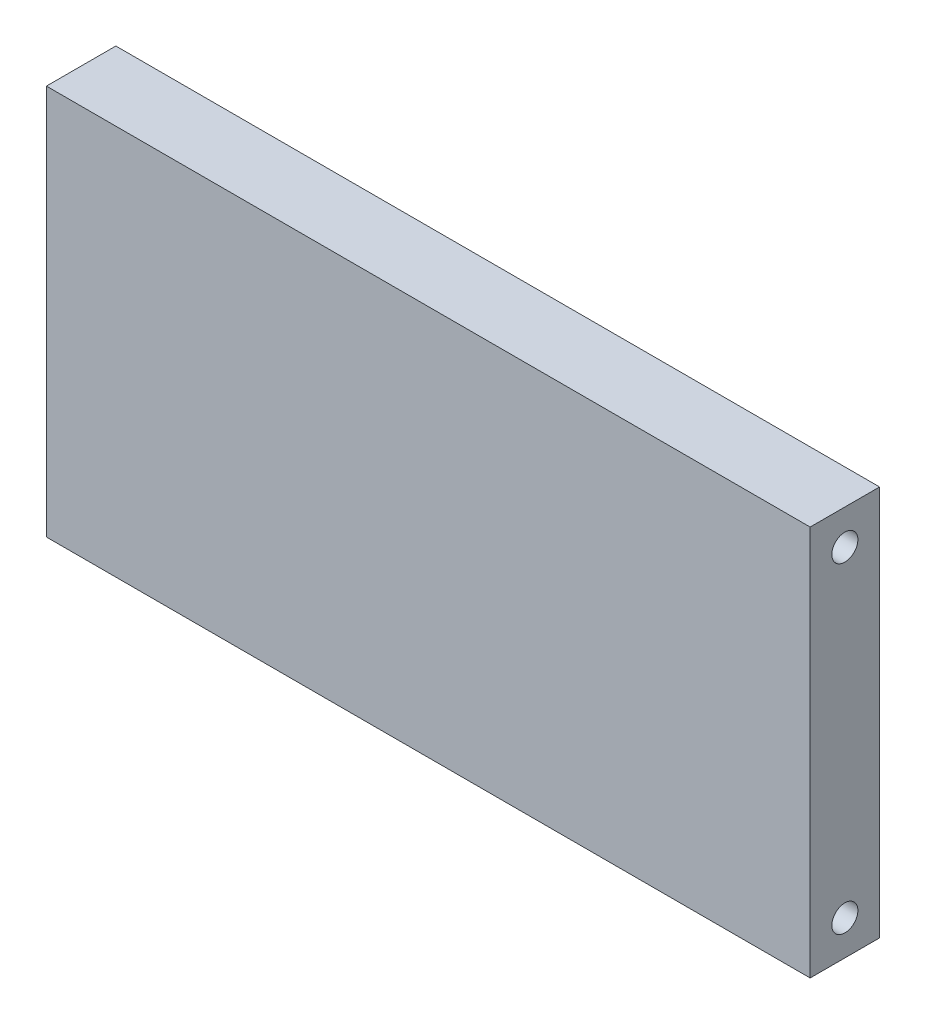
ISO-10303-21;
HEADER;
FILE_DESCRIPTION(('STEP AP214'),'2;1');
FILE_NAME('part.step','',(''),(''),'','','');
FILE_SCHEMA(('AUTOMOTIVE_DESIGN { 1 0 10303 214 1 1 1 1 }'));
ENDSEC;
DATA;
#1=APPLICATION_CONTEXT('core data for automotive mechanical design processes');
#2=APPLICATION_PROTOCOL_DEFINITION('international standard','automotive_design',2000,#1);
#3=PRODUCT_CONTEXT('',#1,'mechanical');
#4=PRODUCT('Part','Part','',(#3));
#5=PRODUCT_RELATED_PRODUCT_CATEGORY('part','',(#4));
#6=PRODUCT_DEFINITION_FORMATION('','',#4);
#7=PRODUCT_DEFINITION_CONTEXT('part definition',#1,'design');
#8=PRODUCT_DEFINITION('design','',#6,#7);
#9=PRODUCT_DEFINITION_SHAPE('','',#8);
#10=(LENGTH_UNIT() NAMED_UNIT(*) SI_UNIT(.MILLI.,.METRE.));
#11=(NAMED_UNIT(*) PLANE_ANGLE_UNIT() SI_UNIT($,.RADIAN.));
#12=(NAMED_UNIT(*) SI_UNIT($,.STERADIAN.) SOLID_ANGLE_UNIT());
#13=UNCERTAINTY_MEASURE_WITH_UNIT(LENGTH_MEASURE(1.E-05),#10,'distance_accuracy_value','');
#14=(GEOMETRIC_REPRESENTATION_CONTEXT(3) GLOBAL_UNCERTAINTY_ASSIGNED_CONTEXT((#13)) GLOBAL_UNIT_ASSIGNED_CONTEXT((#10,
#11,#12)) REPRESENTATION_CONTEXT('',''));
#15=CARTESIAN_POINT('',(0.,0.,0.));
#16=DIRECTION('',(0.,0.,1.));
#17=DIRECTION('',(1.,0.,0.));
#18=AXIS2_PLACEMENT_3D('',#15,#16,#17);
#19=CARTESIAN_POINT('',(0.,0.,8.));
#20=DIRECTION('',(1.,0.,0.));
#21=DIRECTION('',(0.,0.,-1.));
#22=AXIS2_PLACEMENT_3D('',#19,#20,#21);
#23=PLANE('',#22);
#24=CARTESIAN_POINT('',(0.,41.,3.99999999999999));
#25=DIRECTION('',(-1.,0.,0.));
#26=DIRECTION('',(0.,0.,1.));
#27=AXIS2_PLACEMENT_3D('',#24,#25,#26);
#28=CIRCLE('',#27,1.5);
#29=CARTESIAN_POINT('',(0.,41.,5.5));
#30=VERTEX_POINT('',#29);
#31=EDGE_CURVE('E129',#30,#30,#28,.T.);
#32=ORIENTED_EDGE('',*,*,#31,.F.);
#33=EDGE_LOOP('',(#32));
#34=FACE_BOUND('',#33,.T.);
#35=CARTESIAN_POINT('',(0.,4.,4.));
#36=DIRECTION('',(-1.,0.,0.));
#37=DIRECTION('',(0.,0.,-1.));
#38=AXIS2_PLACEMENT_3D('',#35,#36,#37);
#39=CIRCLE('',#38,1.5);
#40=CARTESIAN_POINT('',(0.,4.,2.5));
#41=VERTEX_POINT('',#40);
#42=EDGE_CURVE('E136',#41,#41,#39,.T.);
#43=ORIENTED_EDGE('',*,*,#42,.F.);
#44=EDGE_LOOP('',(#43));
#45=FACE_BOUND('',#44,.T.);
#46=DIRECTION('',(0.,-1.,0.));
#47=VECTOR('',#46,1.);
#48=CARTESIAN_POINT('',(0.,0.,0.));
#49=LINE('',#48,#47);
#50=CARTESIAN_POINT('',(0.,45.,0.));
#51=VERTEX_POINT('',#50);
#52=CARTESIAN_POINT('',(0.,0.,0.));
#53=VERTEX_POINT('',#52);
#54=EDGE_CURVE('E113',#51,#53,#49,.T.);
#55=ORIENTED_EDGE('',*,*,#54,.T.);
#56=DIRECTION('',(0.,0.,-1.));
#57=VECTOR('',#56,1.);
#58=CARTESIAN_POINT('',(0.,0.,8.));
#59=LINE('',#58,#57);
#60=CARTESIAN_POINT('',(0.,0.,8.));
#61=VERTEX_POINT('',#60);
#62=EDGE_CURVE('E11',#61,#53,#59,.T.);
#63=ORIENTED_EDGE('',*,*,#62,.F.);
#64=DIRECTION('',(0.,-1.,0.));
#65=VECTOR('',#64,1.);
#66=CARTESIAN_POINT('',(0.,0.,8.));
#67=LINE('',#66,#65);
#68=CARTESIAN_POINT('',(0.,45.,8.));
#69=VERTEX_POINT('',#68);
#70=EDGE_CURVE('E96',#69,#61,#67,.T.);
#71=ORIENTED_EDGE('',*,*,#70,.F.);
#72=DIRECTION('',(0.,0.,-1.));
#73=VECTOR('',#72,1.);
#74=CARTESIAN_POINT('',(0.,45.,8.));
#75=LINE('',#74,#73);
#76=EDGE_CURVE('E109',#69,#51,#75,.T.);
#77=ORIENTED_EDGE('',*,*,#76,.T.);
#78=EDGE_LOOP('',(#55,#63,#71,#77));
#79=FACE_BOUND('',#78,.T.);
#80=ADVANCED_FACE('F42',(#34,#45,#79),#23,.F.);
#81=CARTESIAN_POINT('',(0.,0.,8.));
#82=DIRECTION('',(0.,1.,0.));
#83=DIRECTION('',(0.,0.,1.));
#84=AXIS2_PLACEMENT_3D('',#81,#82,#83);
#85=PLANE('',#84);
#86=DIRECTION('',(1.,0.,0.));
#87=VECTOR('',#86,1.);
#88=CARTESIAN_POINT('',(0.,0.,0.));
#89=LINE('',#88,#87);
#90=CARTESIAN_POINT('',(88.,0.,0.));
#91=VERTEX_POINT('',#90);
#92=EDGE_CURVE('E101',#53,#91,#89,.T.);
#93=ORIENTED_EDGE('',*,*,#92,.T.);
#94=DIRECTION('',(0.,0.,-1.));
#95=VECTOR('',#94,1.);
#96=CARTESIAN_POINT('',(88.,0.,8.));
#97=LINE('',#96,#95);
#98=CARTESIAN_POINT('',(88.,0.,8.));
#99=VERTEX_POINT('',#98);
#100=EDGE_CURVE('E52',#99,#91,#97,.T.);
#101=ORIENTED_EDGE('',*,*,#100,.F.);
#102=DIRECTION('',(1.,0.,0.));
#103=VECTOR('',#102,1.);
#104=CARTESIAN_POINT('',(0.,0.,8.));
#105=LINE('',#104,#103);
#106=EDGE_CURVE('E91',#61,#99,#105,.T.);
#107=ORIENTED_EDGE('',*,*,#106,.F.);
#108=ORIENTED_EDGE('',*,*,#62,.T.);
#109=EDGE_LOOP('',(#93,#101,#107,#108));
#110=FACE_BOUND('',#109,.T.);
#111=ADVANCED_FACE('F100',(#110),#85,.F.);
#112=CARTESIAN_POINT('',(88.,0.,8.));
#113=DIRECTION('',(-1.,0.,0.));
#114=DIRECTION('',(0.,0.,1.));
#115=AXIS2_PLACEMENT_3D('',#112,#113,#114);
#116=PLANE('',#115);
#117=CARTESIAN_POINT('',(88.,41.,3.99999999999999));
#118=DIRECTION('',(-1.,0.,0.));
#119=DIRECTION('',(0.,0.,1.));
#120=AXIS2_PLACEMENT_3D('',#117,#118,#119);
#121=CIRCLE('',#120,1.5);
#122=CARTESIAN_POINT('',(88.,41.,5.5));
#123=VERTEX_POINT('',#122);
#124=EDGE_CURVE('E45',#123,#123,#121,.T.);
#125=ORIENTED_EDGE('',*,*,#124,.T.);
#126=EDGE_LOOP('',(#125));
#127=FACE_BOUND('',#126,.T.);
#128=CARTESIAN_POINT('',(88.,4.,4.));
#129=DIRECTION('',(-1.,0.,0.));
#130=DIRECTION('',(0.,0.,1.));
#131=AXIS2_PLACEMENT_3D('',#128,#129,#130);
#132=CIRCLE('',#131,1.5);
#133=CARTESIAN_POINT('',(88.,4.,5.5));
#134=VERTEX_POINT('',#133);
#135=EDGE_CURVE('E126',#134,#134,#132,.T.);
#136=ORIENTED_EDGE('',*,*,#135,.T.);
#137=EDGE_LOOP('',(#136));
#138=FACE_BOUND('',#137,.T.);
#139=DIRECTION('',(0.,1.,0.));
#140=VECTOR('',#139,1.);
#141=CARTESIAN_POINT('',(88.,0.,0.));
#142=LINE('',#141,#140);
#143=CARTESIAN_POINT('',(88.,45.,0.));
#144=VERTEX_POINT('',#143);
#145=EDGE_CURVE('E78',#91,#144,#142,.T.);
#146=ORIENTED_EDGE('',*,*,#145,.T.);
#147=DIRECTION('',(0.,0.,-1.));
#148=VECTOR('',#147,1.);
#149=CARTESIAN_POINT('',(88.,45.,8.));
#150=LINE('',#149,#148);
#151=CARTESIAN_POINT('',(88.,45.,8.));
#152=VERTEX_POINT('',#151);
#153=EDGE_CURVE('E103',#152,#144,#150,.T.);
#154=ORIENTED_EDGE('',*,*,#153,.F.);
#155=DIRECTION('',(0.,1.,0.));
#156=VECTOR('',#155,1.);
#157=CARTESIAN_POINT('',(88.,0.,8.));
#158=LINE('',#157,#156);
#159=EDGE_CURVE('E94',#99,#152,#158,.T.);
#160=ORIENTED_EDGE('',*,*,#159,.F.);
#161=ORIENTED_EDGE('',*,*,#100,.T.);
#162=EDGE_LOOP('',(#146,#154,#160,#161));
#163=FACE_BOUND('',#162,.T.);
#164=ADVANCED_FACE('F105',(#127,#138,#163),#116,.F.);
#165=CARTESIAN_POINT('',(0.,45.,8.));
#166=DIRECTION('',(0.,-1.,0.));
#167=DIRECTION('',(0.,0.,-1.));
#168=AXIS2_PLACEMENT_3D('',#165,#166,#167);
#169=PLANE('',#168);
#170=DIRECTION('',(-1.,0.,0.));
#171=VECTOR('',#170,1.);
#172=CARTESIAN_POINT('',(0.,45.,0.));
#173=LINE('',#172,#171);
#174=EDGE_CURVE('E84',#144,#51,#173,.T.);
#175=ORIENTED_EDGE('',*,*,#174,.T.);
#176=ORIENTED_EDGE('',*,*,#76,.F.);
#177=DIRECTION('',(-1.,0.,0.));
#178=VECTOR('',#177,1.);
#179=CARTESIAN_POINT('',(0.,45.,8.));
#180=LINE('',#179,#178);
#181=EDGE_CURVE('E61',#152,#69,#180,.T.);
#182=ORIENTED_EDGE('',*,*,#181,.F.);
#183=ORIENTED_EDGE('',*,*,#153,.T.);
#184=EDGE_LOOP('',(#175,#176,#182,#183));
#185=FACE_BOUND('',#184,.T.);
#186=ADVANCED_FACE('F163',(#185),#169,.F.);
#187=CARTESIAN_POINT('',(0.,0.,8.));
#188=DIRECTION('',(0.,0.,-1.));
#189=DIRECTION('',(-1.,0.,0.));
#190=AXIS2_PLACEMENT_3D('',#187,#188,#189);
#191=PLANE('',#190);
#192=ORIENTED_EDGE('',*,*,#70,.T.);
#193=ORIENTED_EDGE('',*,*,#106,.T.);
#194=ORIENTED_EDGE('',*,*,#159,.T.);
#195=ORIENTED_EDGE('',*,*,#181,.T.);
#196=EDGE_LOOP('',(#192,#193,#194,#195));
#197=FACE_BOUND('',#196,.T.);
#198=ADVANCED_FACE('F92',(#197),#191,.F.);
#199=CARTESIAN_POINT('',(0.,0.,0.));
#200=DIRECTION('',(0.,0.,-1.));
#201=DIRECTION('',(-1.,0.,0.));
#202=AXIS2_PLACEMENT_3D('',#199,#200,#201);
#203=PLANE('',#202);
#204=ORIENTED_EDGE('',*,*,#54,.F.);
#205=ORIENTED_EDGE('',*,*,#174,.F.);
#206=ORIENTED_EDGE('',*,*,#145,.F.);
#207=ORIENTED_EDGE('',*,*,#92,.F.);
#208=EDGE_LOOP('',(#204,#205,#206,#207));
#209=FACE_BOUND('',#208,.T.);
#210=ADVANCED_FACE('F154',(#209),#203,.T.);
#211=CARTESIAN_POINT('',(144.,4.,4.));
#212=DIRECTION('',(-1.,0.,0.));
#213=DIRECTION('',(0.,0.,1.));
#214=AXIS2_PLACEMENT_3D('',#211,#212,#213);
#215=CYLINDRICAL_SURFACE('',#214,1.5);
#216=ORIENTED_EDGE('',*,*,#42,.T.);
#217=EDGE_LOOP('',(#216));
#218=FACE_BOUND('',#217,.T.);
#219=ORIENTED_EDGE('',*,*,#135,.F.);
#220=EDGE_LOOP('',(#219));
#221=FACE_BOUND('',#220,.T.);
#222=ADVANCED_FACE('F146',(#218,#221),#215,.F.);
#223=CARTESIAN_POINT('',(144.,41.,3.99999999999999));
#224=DIRECTION('',(-1.,0.,0.));
#225=DIRECTION('',(0.,0.,1.));
#226=AXIS2_PLACEMENT_3D('',#223,#224,#225);
#227=CYLINDRICAL_SURFACE('',#226,1.5);
#228=ORIENTED_EDGE('',*,*,#31,.T.);
#229=EDGE_LOOP('',(#228));
#230=FACE_BOUND('',#229,.T.);
#231=ORIENTED_EDGE('',*,*,#124,.F.);
#232=EDGE_LOOP('',(#231));
#233=FACE_BOUND('',#232,.T.);
#234=ADVANCED_FACE('F161',(#230,#233),#227,.F.);
#235=CLOSED_SHELL('',(#80,#111,#164,#186,#198,#210,#222,#234));
#236=MANIFOLD_SOLID_BREP('B2',#235);
#237=ADVANCED_BREP_SHAPE_REPRESENTATION('',(#18,#236),#14);
#238=SHAPE_DEFINITION_REPRESENTATION(#9,#237);
ENDSEC;
END-ISO-10303-21;
